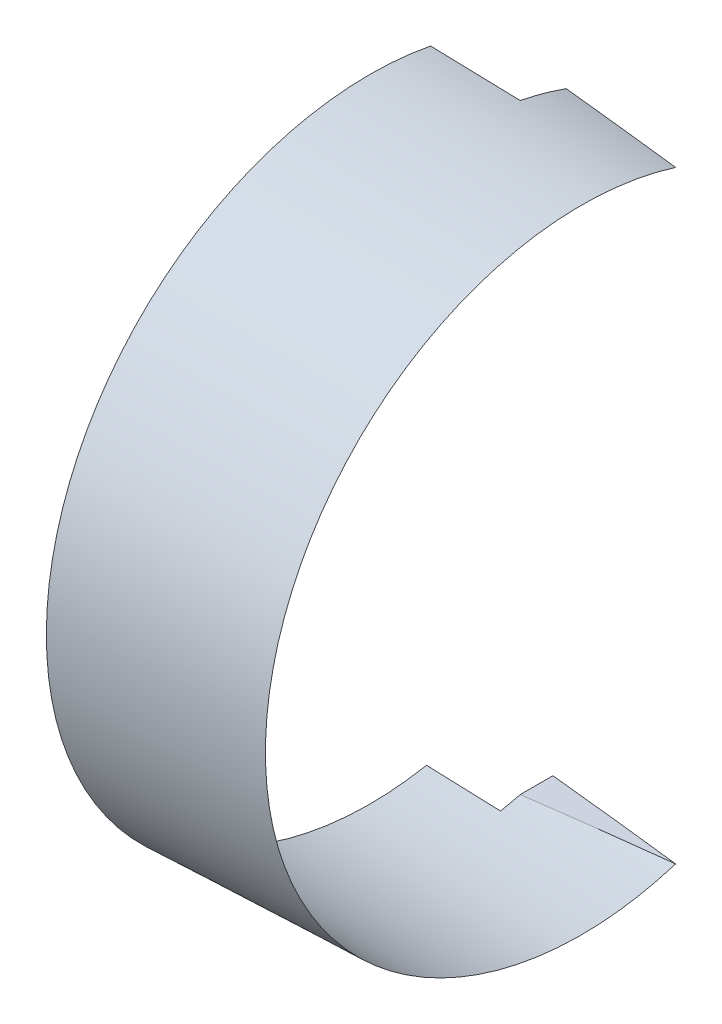
ISO-10303-21;
HEADER;
FILE_DESCRIPTION(('STEP AP214'),'2;1');
FILE_NAME('part.step','',(''),(''),'','','');
FILE_SCHEMA(('AUTOMOTIVE_DESIGN { 1 0 10303 214 1 1 1 1 }'));
ENDSEC;
DATA;
#1=APPLICATION_CONTEXT('core data for automotive mechanical design processes');
#2=APPLICATION_PROTOCOL_DEFINITION('international standard','automotive_design',2000,#1);
#3=PRODUCT_CONTEXT('',#1,'mechanical');
#4=PRODUCT('Part','Part','',(#3));
#5=PRODUCT_RELATED_PRODUCT_CATEGORY('part','',(#4));
#6=PRODUCT_DEFINITION_FORMATION('','',#4);
#7=PRODUCT_DEFINITION_CONTEXT('part definition',#1,'design');
#8=PRODUCT_DEFINITION('design','',#6,#7);
#9=PRODUCT_DEFINITION_SHAPE('','',#8);
#10=(LENGTH_UNIT() NAMED_UNIT(*) SI_UNIT(.MILLI.,.METRE.));
#11=(NAMED_UNIT(*) PLANE_ANGLE_UNIT() SI_UNIT($,.RADIAN.));
#12=(NAMED_UNIT(*) SI_UNIT($,.STERADIAN.) SOLID_ANGLE_UNIT());
#13=UNCERTAINTY_MEASURE_WITH_UNIT(LENGTH_MEASURE(1.E-05),#10,'distance_accuracy_value','');
#14=(GEOMETRIC_REPRESENTATION_CONTEXT(3) GLOBAL_UNCERTAINTY_ASSIGNED_CONTEXT((#13)) GLOBAL_UNIT_ASSIGNED_CONTEXT((#10,
#11,#12)) REPRESENTATION_CONTEXT('',''));
#15=CARTESIAN_POINT('',(0.,0.,0.));
#16=DIRECTION('',(0.,0.,1.));
#17=DIRECTION('',(1.,0.,0.));
#18=AXIS2_PLACEMENT_3D('',#15,#16,#17);
#19=CARTESIAN_POINT('',(-30.4,20.25,10.));
#20=DIRECTION('',(1.,0.,0.));
#21=DIRECTION('',(0.,0.,-1.));
#22=AXIS2_PLACEMENT_3D('',#19,#20,#21);
#23=PLANE('',#22);
#24=CARTESIAN_POINT('',(-30.4,20.25,10.));
#25=DIRECTION('',(-1.,0.,0.));
#26=DIRECTION('',(0.,0.,1.));
#27=AXIS2_PLACEMENT_3D('',#24,#25,#26);
#28=CIRCLE('',#27,21.8730192372937);
#29=CARTESIAN_POINT('',(-30.4,-1.2826345896409,6.15622344769881));
#30=VERTEX_POINT('',#29);
#31=CARTESIAN_POINT('',(-30.4,41.7319096759902,5.88216959703025));
#32=VERTEX_POINT('',#31);
#33=EDGE_CURVE('E96',#30,#32,#28,.T.);
#34=ORIENTED_EDGE('',*,*,#33,.T.);
#35=CARTESIAN_POINT('',(-35.2809816151385,41.9150712459397,5.93306733879514));
#36=CARTESIAN_POINT('',(-35.2156799244927,40.7118391623467,6.55850174005771));
#37=CARTESIAN_POINT('',(-35.1580639980427,40.8508936598999,7.90777717509679));
#38=CARTESIAN_POINT('',(-34.648094678725,41.8913463356917,5.92647455650173));
#39=CARTESIAN_POINT('',(-34.5874994408756,40.7329855433716,6.56544779088039));
#40=CARTESIAN_POINT('',(-34.5237847408817,40.8704410912587,7.88105479625875));
#41=CARTESIAN_POINT('',(-34.0152556339012,41.8676141871513,5.91987976279982));
#42=CARTESIAN_POINT('',(-33.9542630668032,40.7540623106605,6.57036802597755));
#43=CARTESIAN_POINT('',(-33.8895799767418,40.889774683845,7.85264647986157));
#44=CARTESIAN_POINT('',(-32.7496968605726,41.8201363090826,5.90668640145142));
#45=CARTESIAN_POINT('',(-32.6880980602763,40.7956813932788,6.57585912086637));
#46=CARTESIAN_POINT('',(-32.6213511889739,40.9279236774656,7.79207297152685));
#47=CARTESIAN_POINT('',(-32.1169771355272,41.796390579223,5.90008783371286));
#48=CARTESIAN_POINT('',(-32.054902449713,40.816240142011,6.57649464036427));
#49=CARTESIAN_POINT('',(-31.9873271703748,40.9467390652549,7.75990768367434));
#50=CARTESIAN_POINT('',(-30.8518787855769,41.7488938753698,5.88688924097273));
#51=CARTESIAN_POINT('',(-30.789057211283,40.8567869015652,6.57335473674702));
#52=CARTESIAN_POINT('',(-30.7196902837336,40.9837552727974,7.69144553667662));
#53=CARTESIAN_POINT('',(-30.2195001147337,41.7251429043849,5.88028921680727));
#54=CARTESIAN_POINT('',(-30.1561642428217,40.8767905553054,6.56964130279505));
#55=CARTESIAN_POINT('',(-30.0860773514703,41.0019562524431,7.65514976335802));
#56=CARTESIAN_POINT('',(-28.9549857663184,41.6776320631757,5.86708669551654));
#57=CARTESIAN_POINT('',(-28.8908221725302,40.916172538875,6.55759962598259));
#58=CARTESIAN_POINT('',(-28.8191766328192,41.0376157963712,7.57783900375576));
#59=CARTESIAN_POINT('',(-28.3228500863939,41.653872193042,5.8604841984165));
#60=CARTESIAN_POINT('',(-28.2581458651447,40.9355660739896,6.54933065979905));
#61=CARTESIAN_POINT('',(-28.1858888432627,41.0550743680302,7.53682406437634));
#62=CARTESIAN_POINT('',(-27.027456460115,41.6051642136159,5.84694901109855));
#63=CARTESIAN_POINT('',(-26.9622681245744,40.9745729298379,6.52730380386234));
#64=CARTESIAN_POINT('',(-26.8882348003371,41.0899143975297,7.44709841844053));
#65=CARTESIAN_POINT('',(-26.3642149329316,41.5802158031246,5.84001623718216));
#66=CARTESIAN_POINT('',(-26.2984390882934,40.9941795164881,6.51335305440222));
#67=CARTESIAN_POINT('',(-26.2238899977432,41.1072487978185,7.39810634191769));
#68=CARTESIAN_POINT('',(-25.3697108633052,41.5427917991561,5.82961669053969));
#69=CARTESIAN_POINT('',(-25.3000426854913,41.0229619503299,6.48770379780736));
#70=CARTESIAN_POINT('',(-25.2278354639417,41.1322474767367,7.31896973556447));
#71=CARTESIAN_POINT('',(-25.0382468619352,41.530316058139,5.82614987681458));
#72=CARTESIAN_POINT('',(-24.9683449877134,41.0324092623754,6.47842125997903));
#73=CARTESIAN_POINT('',(-24.8958720191684,41.1404137331788,7.29164741779113));
#74=CARTESIAN_POINT('',(-24.3754838699584,41.5053658357537,5.81921659940115));
#75=CARTESIAN_POINT('',(-24.3051502790381,41.0510324114464,6.45817384005793));
#76=CARTESIAN_POINT('',(-24.2321507052404,41.1563501423939,7.2348439806275));
#77=CARTESIAN_POINT('',(-24.044184881645,41.492891354405,5.8157501357182));
#78=CARTESIAN_POINT('',(-23.9736247362144,41.0602107117219,6.44721864331171));
#79=CARTESIAN_POINT('',(-23.9003928389278,41.1641202898061,7.20536283203321));
#80=CARTESIAN_POINT('',(-23.7129882135804,41.4804182523433,5.81228405531762));
#81=CARTESIAN_POINT('',(-23.6411995250586,41.0692647278544,6.43531556709923));
#82=CARTESIAN_POINT('',(-23.5687604403854,41.1716616052915,7.17466430722612));
#83=(BOUNDED_SURFACE() B_SPLINE_SURFACE(3,2,((#35,#36,#37),(#38,#39,#40),(#41,#42,#43),(#44,#45,
#46),(#47,#48,#49),(#50,#51,#52),(#53,#54,#55),(#56,#57,#58),(#59,#60,#61),(#62,#63,#64),(#65,
#66,#67),(#68,#69,#70),(#71,#72,#73),(#74,#75,#76),(#77,#78,#79),(#80,#81,#82)),.UNSPECIFIED.,
.F.,.F.,.F.) B_SPLINE_SURFACE_WITH_KNOTS((4,2,2,2,2,2,2,4),(3,3),(0.,1.9057191896492,
3.81148704268123,5.71675505762359,7.62200413756297,9.62204994760066,10.6222078022821,
11.6223791892886),(0.,1.),
.UNSPECIFIED.) GEOMETRIC_REPRESENTATION_ITEM() RATIONAL_B_SPLINE_SURFACE(((1.,0.82737924409257,
1.),(1.,0.833845700680789,1.),(1.,0.840217705651093,1.),(1.,0.852784134301826,1.),(1.,
0.858978553443484,1.),(1.,0.871199200470827,1.),(1.,0.877225472043016,1.),(1.,0.889121305567349,
1.),(1.,0.894990869076314,1.),(1.,0.906870028061405,1.),(1.,0.912872060123723,1.),(1.,
0.921759461507691,1.),(1.,0.92470284884212,1.),(1.,0.930551350066559,1.),(1.,0.933456463438184,
1.),(1.,0.936342609587408,1.))) REPRESENTATION_ITEM('') SURFACE());
#84=CARTESIAN_POINT('',(-30.4,41.7319096759902,5.88216959703025));
#85=CARTESIAN_POINT('',(-30.4,41.6878195693817,5.9175522892455));
#86=CARTESIAN_POINT('',(-30.4,41.6452448537327,5.95478004241942));
#87=CARTESIAN_POINT('',(-30.4,41.5633834580594,6.03268698333553));
#88=CARTESIAN_POINT('',(-30.4,41.5240966414849,6.07336602760012));
#89=CARTESIAN_POINT('',(-30.4,41.4117278044773,6.20002471887165));
#90=CARTESIAN_POINT('',(-30.4,41.3439243577924,6.29079726591716));
#91=CARTESIAN_POINT('',(-30.4,41.2245026473519,6.48246244024128));
#92=CARTESIAN_POINT('',(-30.4,41.172896635091,6.58336265216687));
#93=CARTESIAN_POINT('',(-30.4,41.0873290702243,6.79238334434123));
#94=CARTESIAN_POINT('',(-30.4,41.0533667222556,6.90050349887249));
#95=CARTESIAN_POINT('',(-30.4,41.0045292212125,7.11897427376612));
#96=CARTESIAN_POINT('',(-30.4,40.9893216092696,7.22924975142653));
#97=CARTESIAN_POINT('',(-30.4,40.980286167903,7.39538291059206));
#98=CARTESIAN_POINT('',(-30.4,40.9795773061846,7.45094325872427));
#99=CARTESIAN_POINT('',(-30.4,40.9827642479135,7.56193507232418));
#100=CARTESIAN_POINT('',(-30.4,40.9866603266212,7.61736652988897));
#101=CARTESIAN_POINT('',(-30.4,40.9928537876657,7.67256604305121));
#102=B_SPLINE_CURVE_WITH_KNOTS('',3,(#84,#85,#86,#87,#88,#89,#90,#91,#92,#93,#94,#95,#96,#97,
#98,#99,#100,#101),.UNSPECIFIED.,.F.,.F.,(4,2,2,2,2,2,2,2,4),(0.,0.169491951608703,
0.338976860521446,0.677136938528495,1.0155521827223,1.35395217009238,1.68626298146877,
1.85279186417215,2.01933070165064),.UNSPECIFIED.);
#103=CARTESIAN_POINT('',(-30.4,40.9928537876657,7.67256604305121));
#104=VERTEX_POINT('',#103);
#105=EDGE_CURVE('E46',#32,#104,#102,.T.);
#106=ORIENTED_EDGE('',*,*,#105,.T.);
#107=CARTESIAN_POINT('',(-30.4,20.25,10.));
#108=DIRECTION('',(1.,0.,0.));
#109=DIRECTION('',(0.,0.,-1.));
#110=AXIS2_PLACEMENT_3D('',#107,#108,#109);
#111=CIRCLE('',#110,20.8730192372937);
#112=CARTESIAN_POINT('',(-30.4,-0.266050153389992,6.15622344769898));
#113=VERTEX_POINT('',#112);
#114=EDGE_CURVE('E98',#113,#104,#111,.F.);
#115=ORIENTED_EDGE('',*,*,#114,.F.);
#116=DIRECTION('',(0.,1.,1.66037818414903E-13));
#117=VECTOR('',#116,1.);
#118=CARTESIAN_POINT('',(-30.4,-2.55,6.1562234476986));
#119=LINE('',#118,#117);
#120=EDGE_CURVE('E86',#30,#113,#119,.T.);
#121=ORIENTED_EDGE('',*,*,#120,.F.);
#122=EDGE_LOOP('',(#34,#106,#115,#121));
#123=FACE_BOUND('',#122,.T.);
#124=ADVANCED_FACE('F17',(#123),#23,.F.);
#125=CARTESIAN_POINT('',(-25.,-0.15,757.817890449207));
#126=DIRECTION('',(0.,-1.,0.));
#127=DIRECTION('',(0.,0.,-1.));
#128=AXIS2_PLACEMENT_3D('',#125,#126,#127);
#129=PLANE('',#128);
#130=DIRECTION('',(0.,0.,-1.));
#131=VECTOR('',#130,1.);
#132=CARTESIAN_POINT('',(-25.4,-0.15,757.817890449207));
#133=LINE('',#132,#131);
#134=CARTESIAN_POINT('',(-25.4,-0.15,4.81903121821762));
#135=VERTEX_POINT('',#134);
#136=CARTESIAN_POINT('',(-25.4,-0.15,2.60667663159342));
#137=VERTEX_POINT('',#136);
#138=EDGE_CURVE('E133',#135,#137,#133,.T.);
#139=ORIENTED_EDGE('',*,*,#138,.F.);
#140=CARTESIAN_POINT('',(10.1181525308279,-0.15,1.02266959439106));
#141=CARTESIAN_POINT('',(9.3477843915307,-0.15,1.08946034541123));
#142=CARTESIAN_POINT('',(8.57746954508266,-0.15,1.15686744882727));
#143=CARTESIAN_POINT('',(7.03655691914137,-0.15,1.29304433133251));
#144=CARTESIAN_POINT('',(6.26595920063215,-0.15,1.3618148003272));
#145=CARTESIAN_POINT('',(4.72112752575068,-0.15,1.50111862239621));
#146=CARTESIAN_POINT('',(3.94689419726085,-0.15,1.5716589466227));
#147=CARTESIAN_POINT('',(2.39896913756692,-0.15,1.71425317198988));
#148=CARTESIAN_POINT('',(1.62527733275722,-0.15,1.7863062751094));
#149=CARTESIAN_POINT('',(-0.919259386082186,-0.15,2.02604357221741));
#150=CARTESIAN_POINT('',(-2.68977328594317,-0.15,2.19726438579486));
#151=CARTESIAN_POINT('',(-6.22999124363823,-0.15,2.55031336395156));
#152=CARTESIAN_POINT('',(-7.9996951581223,-0.15,2.7321429717567));
#153=CARTESIAN_POINT('',(-11.5439661235381,-0.15,3.10965629530984));
#154=CARTESIAN_POINT('',(-13.318528212493,-0.15,3.3053867764074));
#155=CARTESIAN_POINT('',(-16.8646995117103,-0.15,3.71380712456868));
#156=CARTESIAN_POINT('',(-18.636309828484,-0.15,3.92648726256105));
#157=CARTESIAN_POINT('',(-21.2851643048273,-0.15,4.26212343026085));
#158=CARTESIAN_POINT('',(-22.1635175916069,-0.15,4.3763274337102));
#159=CARTESIAN_POINT('',(-23.9193628685318,-0.15,4.61162458040379));
#160=CARTESIAN_POINT('',(-24.796854799483,-0.15,4.73271816742542));
#161=CARTESIAN_POINT('',(-26.5525180507057,-0.15,4.98355858672857));
#162=CARTESIAN_POINT('',(-27.4306868198948,-0.15,5.11332334641819));
#163=CARTESIAN_POINT('',(-29.1852141375451,-0.15,5.3833999628464));
#164=CARTESIAN_POINT('',(-30.0615730461411,-0.15,5.52370946018671));
#165=CARTESIAN_POINT('',(-31.8046538382225,-0.15,5.81693623526656));
#166=CARTESIAN_POINT('',(-32.6713950205206,-0.15,5.96973825113071));
#167=CARTESIAN_POINT('',(-34.4021883194014,-0.15,6.29408587740245));
#168=CARTESIAN_POINT('',(-35.2662376261863,-0.15,6.46564685352767));
#169=CARTESIAN_POINT('',(-36.5561028083291,-0.15,6.74378491100872));
#170=CARTESIAN_POINT('',(-36.9841998012547,-0.15,6.83975780562587));
#171=CARTESIAN_POINT('',(-37.838381726924,-0.15,7.040832959516));
#172=CARTESIAN_POINT('',(-38.2644661493878,-0.15,7.14593741547561));
#173=CARTESIAN_POINT('',(-39.1128058011187,-0.15,7.36826058022749));
#174=CARTESIAN_POINT('',(-39.53506572761,-0.15,7.48546130677333));
#175=CARTESIAN_POINT('',(-40.3743013617469,-0.15,7.7373407407708));
#176=CARTESIAN_POINT('',(-40.7912799058829,-0.15,7.87200958811253));
#177=CARTESIAN_POINT('',(-41.2868839092546,-0.15,8.05130859073838));
#178=CARTESIAN_POINT('',(-41.3704701002029,-0.15,8.08221853787248));
#179=CARTESIAN_POINT('',(-41.5371244693646,-0.15,8.14542621503415));
#180=CARTESIAN_POINT('',(-41.6201925932987,-0.15,8.17772408777155));
#181=CARTESIAN_POINT('',(-41.8686229908221,-0.15,8.27700975395256));
#182=CARTESIAN_POINT('',(-42.0330691409134,-0.15,8.34633888419944));
#183=CARTESIAN_POINT('',(-42.3573379458007,-0.15,8.49296540906684));
#184=CARTESIAN_POINT('',(-42.5171805224504,-0.15,8.57021851368774));
#185=CARTESIAN_POINT('',(-42.8306602160068,-0.15,8.73632645703977));
#186=CARTESIAN_POINT('',(-42.9843070441687,-0.15,8.82516213580718));
#187=CARTESIAN_POINT('',(-43.2196336345814,-0.15,8.98110801214535));
#188=CARTESIAN_POINT('',(-43.3051630078071,-0.15,9.04235490475215));
#189=CARTESIAN_POINT('',(-43.4693973045476,-0.15,9.1735917778491));
#190=CARTESIAN_POINT('',(-43.5481099334993,-0.15,9.24357166241876));
#191=CARTESIAN_POINT('',(-43.6632389521217,-0.15,9.36421557698417));
#192=CARTESIAN_POINT('',(-43.703718761308,-0.15,9.41095629577379));
#193=CARTESIAN_POINT('',(-43.7782641498707,-0.15,9.50936552688335));
#194=CARTESIAN_POINT('',(-43.8123384541944,-0.15,9.56102718962681));
#195=CARTESIAN_POINT('',(-43.8635730121916,-0.15,9.65593938355106));
#196=CARTESIAN_POINT('',(-43.8828318853954,-0.15,9.6980385578331));
#197=CARTESIAN_POINT('',(-43.9143076657566,-0.15,9.78479425674032));
#198=CARTESIAN_POINT('',(-43.9265360851591,-0.15,9.82944646820256));
#199=CARTESIAN_POINT('',(-43.9425592849577,-0.15,9.92073128591658));
#200=CARTESIAN_POINT('',(-43.9462730677812,-0.15,9.96737864655451));
#201=CARTESIAN_POINT('',(-43.9444515545423,-0.15,10.0604999260674));
#202=CARTESIAN_POINT('',(-43.9389141855011,-0.15,10.1069738037299));
#203=CARTESIAN_POINT('',(-43.9206752025029,-0.15,10.1922420324432));
#204=CARTESIAN_POINT('',(-43.9089754005746,-0.15,10.2312608311546));
#205=CARTESIAN_POINT('',(-43.8802553308418,-0.15,10.3072558523467));
#206=CARTESIAN_POINT('',(-43.8632333678804,-0.15,10.3442314196178));
#207=CARTESIAN_POINT('',(-43.8099084619187,-0.15,10.4442198251818));
#208=CARTESIAN_POINT('',(-43.7689908235016,-0.15,10.5047517450037));
#209=CARTESIAN_POINT('',(-43.6787602524554,-0.15,10.6192079685063));
#210=CARTESIAN_POINT('',(-43.6294157251219,-0.15,10.6731060412534));
#211=CARTESIAN_POINT('',(-43.50668542012,-0.15,10.7939132917045));
#212=CARTESIAN_POINT('',(-43.4310480190041,-0.15,10.8585029452344));
#213=CARTESIAN_POINT('',(-43.2739753973511,-0.15,10.9802980532569));
#214=CARTESIAN_POINT('',(-43.1925279314708,-0.15,11.0374871515212));
#215=CARTESIAN_POINT('',(-42.9420123854847,-0.15,11.2012635334478));
#216=CARTESIAN_POINT('',(-42.7674978657285,-0.15,11.2994337761119));
#217=CARTESIAN_POINT('',(-42.4049712792693,-0.15,11.4854454532404));
#218=CARTESIAN_POINT('',(-42.2166982833049,-0.15,11.5727508779497));
#219=CARTESIAN_POINT('',(-41.8357348245321,-0.15,11.7372477045986));
#220=CARTESIAN_POINT('',(-41.6430427230959,-0.15,11.8144352811384));
#221=CARTESIAN_POINT('',(-41.0599386336694,-0.15,12.0354884580573));
#222=CARTESIAN_POINT('',(-40.6654288230063,-0.15,12.1684102389866));
#223=CARTESIAN_POINT('',(-39.8706425455228,-0.15,12.4167924201906));
#224=CARTESIAN_POINT('',(-39.4703597763413,-0.15,12.5322318579582));
#225=CARTESIAN_POINT('',(-38.6670873958007,-0.15,12.7506735932053));
#226=CARTESIAN_POINT('',(-38.2641028233713,-0.15,12.853694527553));
#227=CARTESIAN_POINT('',(-37.4601783376117,-0.15,13.0496941929844));
#228=CARTESIAN_POINT('',(-37.0592609608059,-0.15,13.1427664865019));
#229=CARTESIAN_POINT('',(-36.255882610136,-0.15,13.3220214919038));
#230=CARTESIAN_POINT('',(-35.8534215814389,-0.15,13.40820395663));
#231=CARTESIAN_POINT('',(-34.6442022024362,-0.15,13.658541588315));
#232=CARTESIAN_POINT('',(-33.8357410429889,-0.15,13.8144555432838));
#233=CARTESIAN_POINT('',(-32.2151148259626,-0.15,14.1111936469418));
#234=CARTESIAN_POINT('',(-31.4029465132991,-0.15,14.2519996846613));
#235=CARTESIAN_POINT('',(-29.7767859639218,-0.15,14.5220959044477));
#236=CARTESIAN_POINT('',(-28.9627939085515,-0.15,14.6513871835527));
#237=CARTESIAN_POINT('',(-27.334976817698,-0.15,14.9007424626543));
#238=CARTESIAN_POINT('',(-26.521154358979,-0.15,15.0208233945619));
#239=CARTESIAN_POINT('',(-24.8924555240897,-0.15,15.2537178699878));
#240=CARTESIAN_POINT('',(-24.0775791237586,-0.15,15.3665312437786));
#241=CARTESIAN_POINT('',(-21.6326018952728,-0.15,15.6958761386299));
#242=CARTESIAN_POINT('',(-20.0012935943197,-0.15,15.9034410745902));
#243=CARTESIAN_POINT('',(-16.7702116057473,-0.15,16.2971119063462));
#244=CARTESIAN_POINT('',(-15.1704804492335,-0.15,16.483571733466));
#245=CARTESIAN_POINT('',(-11.9693522104545,-0.15,16.8435893992575));
#246=CARTESIAN_POINT('',(-10.3679549315464,-0.15,17.017145483327));
#247=CARTESIAN_POINT('',(-7.16396915585724,-0.15,17.3539171655096));
#248=CARTESIAN_POINT('',(-5.56138058562879,-0.15,17.5171320612697));
#249=CARTESIAN_POINT('',(-2.35541881956578,-0.15,17.8350264494595));
#250=CARTESIAN_POINT('',(-0.752045654624622,-0.15,17.9897062543438));
#251=CARTESIAN_POINT('',(2.39560166565168,-0.15,18.2862752698416));
#252=CARTESIAN_POINT('',(3.93985123584826,-0.15,18.4284263282041));
#253=CARTESIAN_POINT('',(7.02871573417082,-0.15,18.706970144653));
#254=CARTESIAN_POINT('',(8.57333061085537,-0.15,18.8433634725768));
#255=CARTESIAN_POINT('',(10.1181525308279,-0.15,18.9773304056089));
#256=B_SPLINE_CURVE_WITH_KNOTS('',3,(#140,#141,#142,#143,#144,#145,#146,#147,#148,#149,#150,
#151,#152,#153,#154,#155,#156,#157,#158,#159,#160,#161,#162,#163,#164,#165,#166,#167,#168,#169,
#170,#171,#172,#173,#174,#175,#176,#177,#178,#179,#180,#181,#182,#183,#184,#185,#186,#187,#188,
#189,#190,#191,#192,#193,#194,#195,#196,#197,#198,#199,#200,#201,#202,#203,#204,#205,#206,#207,
#208,#209,#210,#211,#212,#213,#214,#215,#216,#217,#218,#219,#220,#221,#222,#223,#224,#225,#226,
#227,#228,#229,#230,#231,#232,#233,#234,#235,#236,#237,#238,#239,#240,#241,#242,#243,#244,#245,
#246,#247,#248,#249,#250,#251,#252,#253,#254,#255),.UNSPECIFIED.,.F.,.F.,(4,2,2,2,2,2,2,2,2,2,2,
2,2,2,2,2,2,2,2,2,2,2,2,2,2,2,2,2,2,2,2,2,2,2,2,2,2,2,2,2,2,2,2,2,2,2,2,2,2,2,2,2,2,2,2,2,2,4),
(0.,2.3197742201638,4.64075389918069,6.97307273110425,9.30419068351168,14.6404846714749,
19.9775063120299,25.3334211889886,30.6862836219685,33.3435026757533,36.0008930826756,
38.6639585536406,41.3264299243164,43.9666333032225,46.6090157427183,47.9251180731351,
49.2415378861694,50.5560281598814,51.8697796551635,52.1371232307849,52.4044943613965,
52.9396891753206,53.4720406473413,54.0035224156818,54.3187958419285,54.6337081101514,
54.8188537157351,55.0037452773878,55.1421467115915,55.2803208656156,55.4198040767011,
55.5593185470857,55.6810717029792,55.8028636779378,56.0207731059358,56.2395182310439,
56.5371668235688,56.8354624152533,57.4349039162687,58.057183372955,58.6796974292729,
59.927794844905,61.1773771618332,62.4250602039743,63.6597252682995,64.8944346038065,
67.3642645288256,69.8370228975413,72.3095454282002,74.777407850545,77.2453278867849,
82.1785611918834,87.0101861898919,91.8424669770463,96.6750756122055,101.507507216661,
106.159831289212,110.811693840737),.UNSPECIFIED.);
#257=CARTESIAN_POINT('',(-16.0818800189067,-0.150000443993001,3.62458368396145));
#258=VERTEX_POINT('',#257);
#259=EDGE_CURVE('E129',#258,#135,#256,.T.);
#260=ORIENTED_EDGE('',*,*,#259,.F.);
#261=CARTESIAN_POINT('',(-62.8082811067893,-0.15,-0.632879414674593));
#262=CARTESIAN_POINT('',(-61.3386385128492,-0.15,-0.521838131036939));
#263=CARTESIAN_POINT('',(-59.869097676116,-0.15,-0.409449074674871));
#264=CARTESIAN_POINT('',(-56.9302474357948,-0.15,-0.181672687019172));
#265=CARTESIAN_POINT('',(-55.4609380323724,-0.15,-0.0662853535905476));
#266=CARTESIAN_POINT('',(-51.053815742654,-0.15,0.28479495698715));
#267=CARTESIAN_POINT('',(-48.1163948766174,-0.15,0.525437345784086));
#268=CARTESIAN_POINT('',(-42.2456558523834,-0.15,1.02294366032296));
#269=CARTESIAN_POINT('',(-39.3123364138391,-0.15,1.27979235866851));
#270=CARTESIAN_POINT('',(-34.9136102399036,-0.15,1.68109526654592));
#271=CARTESIAN_POINT('',(-33.4474727149579,-0.15,1.81754482732312));
#272=CARTESIAN_POINT('',(-30.5157755952489,-0.15,2.09666245593365));
#273=CARTESIAN_POINT('',(-29.0502160054168,-0.15,2.23933057571735));
#274=CARTESIAN_POINT('',(-26.1176709337122,-0.15,2.53218223708272));
#275=CARTESIAN_POINT('',(-24.650686521203,-0.15,2.68237651434199));
#276=CARTESIAN_POINT('',(-21.717678932816,-0.15,2.99152759042312));
#277=CARTESIAN_POINT('',(-20.2516557311843,-0.15,3.1504841438821));
#278=CARTESIAN_POINT('',(-17.3213387654425,-0.15,3.47908128540218));
#279=CARTESIAN_POINT('',(-15.857044568226,-0.15,3.64871799849616));
#280=CARTESIAN_POINT('',(-12.9299237830079,-0.15,4.00152449878692));
#281=CARTESIAN_POINT('',(-11.4670973542034,-0.15,4.18469562065558));
#282=CARTESIAN_POINT('',(-9.27370509401197,-0.15,4.47295021685592));
#283=CARTESIAN_POINT('',(-8.54226032736781,-0.15,4.57135022665881));
#284=CARTESIAN_POINT('',(-7.08010714679226,-0.15,4.77341516065072));
#285=CARTESIAN_POINT('',(-6.34939872168464,-0.15,4.87708000366384));
#286=CARTESIAN_POINT('',(-4.88910004395577,-0.15,5.09064694973925));
#287=CARTESIAN_POINT('',(-4.15950953541671,-0.15,5.20054729720189));
#288=CARTESIAN_POINT('',(-2.70147090297684,-0.15,5.4279843500634));
#289=CARTESIAN_POINT('',(-1.97302284574466,-0.15,5.54552148528867));
#290=CARTESIAN_POINT('',(-0.516769503285857,-0.15,5.79032752535793));
#291=CARTESIAN_POINT('',(0.211033668997976,-0.15,5.91760905383828));
#292=CARTESIAN_POINT('',(1.6642732890557,-0.15,6.18461411370423));
#293=CARTESIAN_POINT('',(2.38971008100045,-0.15,6.32433574372716));
#294=CARTESIAN_POINT('',(3.47557792907775,-0.15,6.54691410495816));
#295=CARTESIAN_POINT('',(3.83733119287847,-0.15,6.62331392739042));
#296=CARTESIAN_POINT('',(4.55966621000201,-0.15,6.78138533567012));
#297=CARTESIAN_POINT('',(4.92024802927611,-0.15,6.86305661914104));
#298=CARTESIAN_POINT('',(5.64008586490626,-0.15,7.03291398892296));
#299=CARTESIAN_POINT('',(5.99934111267145,-0.15,7.12110337139043));
#300=CARTESIAN_POINT('',(6.71570461701825,-0.15,7.30605389981168));
#301=CARTESIAN_POINT('',(7.07281243790745,-0.15,7.40281672647669));
#302=CARTESIAN_POINT('',(7.42845753958506,-0.15,7.50489636178006));
#303=B_SPLINE_CURVE_WITH_KNOTS('',3,(#261,#262,#263,#264,#265,#266,#267,#268,#269,#270,#271,
#272,#273,#274,#275,#276,#277,#278,#279,#280,#281,#282,#283,#284,#285,#286,#287,#288,#289,#290,
#291,#292,#293,#294,#295,#296,#297,#298,#299,#300,#301,#302),.UNSPECIFIED.,.F.,.F.,(4,2,2,2,2,2,
2,2,2,2,2,2,2,2,2,2,2,2,2,2,4),(0.,4.42149392257532,8.84299099366609,17.6847399449881,
26.5183014855311,30.9357110578034,35.3531575405593,39.7770953657568,44.2009093738987,
48.6231274850162,53.045782268892,55.2598690348606,57.4739216732695,59.6873540113512,
61.9009110376157,64.1173858469945,66.3335224668844,67.4426896258096,68.5517932181928,
69.661461565257,70.7713479315919),.UNSPECIFIED.);
#304=EDGE_CURVE('E117',#137,#258,#303,.T.);
#305=ORIENTED_EDGE('',*,*,#304,.F.);
#306=EDGE_LOOP('',(#139,#260,#305));
#307=FACE_BOUND('',#306,.T.);
#308=ADVANCED_FACE('F168',(#307),#129,.F.);
#309=CARTESIAN_POINT('',(-30.4,20.25,10.));
#310=DIRECTION('',(-1.,0.,0.));
#311=DIRECTION('',(0.,0.,1.));
#312=AXIS2_PLACEMENT_3D('',#309,#310,#311);
#313=CONICAL_SURFACE('',#312,21.8730192372937,0.0349065850398866);
#314=ORIENTED_EDGE('',*,*,#33,.F.);
#315=CARTESIAN_POINT('',(-45.8202713528625,-1.82942541989308,6.15622344769872));
#316=CARTESIAN_POINT('',(-40.2575349457529,-1.6322532493347,6.15622344769875));
#317=CARTESIAN_POINT('',(-34.6948015274562,-1.43499682873017,6.15622344769878));
#318=CARTESIAN_POINT('',(-23.5693406684183,-1.04031548742631,6.15622344769884));
#319=CARTESIAN_POINT('',(-18.0066132276771,-0.842890566726982,6.15622344769888));
#320=CARTESIAN_POINT('',(-12.4438887757489,-0.645381395981497,6.15622344769891));
#321=B_SPLINE_CURVE_WITH_KNOTS('',3,(#315,#316,#317,#318,#319,#320),.UNSPECIFIED.,.F.,.F.,(4,2,
4),(0.,16.6986891283879,33.397378256987),.UNSPECIFIED.);
#322=CARTESIAN_POINT('',(-25.4,-1.10524788537483,6.15622344769884));
#323=VERTEX_POINT('',#322);
#324=EDGE_CURVE('E83',#30,#323,#321,.T.);
#325=ORIENTED_EDGE('',*,*,#324,.T.);
#326=CARTESIAN_POINT('',(-25.4,20.25,10.));
#327=DIRECTION('',(-1.,0.,0.));
#328=DIRECTION('',(0.,0.,1.));
#329=AXIS2_PLACEMENT_3D('',#326,#327,#328);
#330=CIRCLE('',#329,21.6984153898349);
#331=EDGE_CURVE('E94',#137,#323,#330,.T.);
#332=ORIENTED_EDGE('',*,*,#331,.F.);
#333=ORIENTED_EDGE('',*,*,#304,.T.);
#334=CARTESIAN_POINT('',(-16.0818733585423,20.25,10.));
#335=DIRECTION('',(-1.,0.,0.));
#336=DIRECTION('',(0.,0.,1.));
#337=AXIS2_PLACEMENT_3D('',#334,#335,#336);
#338=CIRCLE('',#337,21.3730192372937);
#339=CARTESIAN_POINT('',(-16.0818800189067,40.6500006659895,3.62458439430303));
#340=VERTEX_POINT('',#339);
#341=EDGE_CURVE('E113',#258,#340,#338,.T.);
#342=ORIENTED_EDGE('',*,*,#341,.T.);
#343=CARTESIAN_POINT('',(7.42845753958506,40.65,7.50489636178011));
#344=CARTESIAN_POINT('',(7.07281243790746,40.65,7.40281672647672));
#345=CARTESIAN_POINT('',(6.71570461701827,40.65,7.30605389981169));
#346=CARTESIAN_POINT('',(5.99934111267147,40.65,7.12110337139041));
#347=CARTESIAN_POINT('',(5.64008586490628,40.65,7.03291398892294));
#348=CARTESIAN_POINT('',(4.92024802927614,40.65,6.86305661914102));
#349=CARTESIAN_POINT('',(4.55966621000202,40.65,6.78138533567012));
#350=CARTESIAN_POINT('',(3.83733119287848,40.65,6.62331392739041));
#351=CARTESIAN_POINT('',(3.47557792907777,40.65,6.54691410495813));
#352=CARTESIAN_POINT('',(2.38971008100048,40.65,6.32433574372711));
#353=CARTESIAN_POINT('',(1.66427328905572,40.65,6.18461411370421));
#354=CARTESIAN_POINT('',(0.21103366899799,40.65,5.91760905383828));
#355=CARTESIAN_POINT('',(-0.516769503285843,40.65,5.79032752535791));
#356=CARTESIAN_POINT('',(-1.97302284574464,40.65,5.54552148528865));
#357=CARTESIAN_POINT('',(-2.70147090297682,40.65,5.42798435006339));
#358=CARTESIAN_POINT('',(-4.15950953541669,40.65,5.20054729720187));
#359=CARTESIAN_POINT('',(-4.88910004395574,40.65,5.09064694973922));
#360=CARTESIAN_POINT('',(-6.34939872168461,40.65,4.87708000366382));
#361=CARTESIAN_POINT('',(-7.08010714679223,40.65,4.7734151606507));
#362=CARTESIAN_POINT('',(-8.54226032736777,40.65,4.5713502266588));
#363=CARTESIAN_POINT('',(-9.27370509401193,40.65,4.47295021685591));
#364=CARTESIAN_POINT('',(-11.4670973542033,40.65,4.18469562065557));
#365=CARTESIAN_POINT('',(-12.9299237830079,40.65,4.00152449878691));
#366=CARTESIAN_POINT('',(-15.857044568226,40.65,3.64871799849616));
#367=CARTESIAN_POINT('',(-17.3213387654424,40.65,3.4790812854022));
#368=CARTESIAN_POINT('',(-20.2516557311842,40.65,3.15048414388206));
#369=CARTESIAN_POINT('',(-21.7176789328159,40.65,2.991527590423));
#370=CARTESIAN_POINT('',(-24.6506865212029,40.65,2.68237651434211));
#371=CARTESIAN_POINT('',(-26.1176709337122,40.65,2.53218223708314));
#372=CARTESIAN_POINT('',(-29.0502160054168,40.65,2.23933057571777));
#373=CARTESIAN_POINT('',(-30.5157755952488,40.65,2.09666245593376));
#374=CARTESIAN_POINT('',(-33.4474727149579,40.65,1.81754482732299));
#375=CARTESIAN_POINT('',(-34.9136102399035,40.65,1.68109526654587));
#376=CARTESIAN_POINT('',(-39.312336413839,40.65,1.27979235866859));
#377=CARTESIAN_POINT('',(-42.2456558523833,40.65,1.02294366032298));
#378=CARTESIAN_POINT('',(-48.1163948766173,40.65,0.525437345784067));
#379=CARTESIAN_POINT('',(-51.0538157426539,40.65,0.284794956987152));
#380=CARTESIAN_POINT('',(-55.4609380323723,40.65,-0.0662853535905392));
#381=CARTESIAN_POINT('',(-56.9302474357947,40.65,-0.181672687019166));
#382=CARTESIAN_POINT('',(-59.8690976761159,40.65,-0.409449074674868));
#383=CARTESIAN_POINT('',(-61.3386385128491,40.65,-0.521838131036937));
#384=CARTESIAN_POINT('',(-62.8082811067892,40.65,-0.632879414674586));
#385=B_SPLINE_CURVE_WITH_KNOTS('',3,(#343,#344,#345,#346,#347,#348,#349,#350,#351,#352,#353,
#354,#355,#356,#357,#358,#359,#360,#361,#362,#363,#364,#365,#366,#367,#368,#369,#370,#371,#372,
#373,#374,#375,#376,#377,#378,#379,#380,#381,#382,#383,#384),.UNSPECIFIED.,.F.,.F.,(4,2,2,2,2,2,
2,2,2,2,2,2,2,2,2,2,2,2,2,2,4),(0.,1.10988636633487,2.21955471339913,3.32865830578234,
4.43782546470755,6.65396208459746,8.87043689397619,11.0839939202407,13.2974262583225,
15.5114788967313,17.7255656626999,22.1482204465757,26.5704385576932,30.9942525658352,
35.4181903910326,39.8356368737885,44.2530464460608,53.0866079866038,61.9283569379258,
66.3498540090165,70.7713479315918),.UNSPECIFIED.);
#386=CARTESIAN_POINT('',(-24.4,40.65,2.70980115733191));
#387=VERTEX_POINT('',#386);
#388=EDGE_CURVE('E106',#340,#387,#385,.T.);
#389=ORIENTED_EDGE('',*,*,#388,.T.);
#390=CARTESIAN_POINT('',(-24.4,20.25,10.));
#391=DIRECTION('',(1.,0.,0.));
#392=DIRECTION('',(0.,0.,-1.));
#393=AXIS2_PLACEMENT_3D('',#390,#391,#392);
#394=CIRCLE('',#393,21.6634946203432);
#395=CARTESIAN_POINT('',(-24.4,41.5062982617679,5.81947570603851));
#396=VERTEX_POINT('',#395);
#397=EDGE_CURVE('E234',#387,#396,#394,.T.);
#398=ORIENTED_EDGE('',*,*,#397,.T.);
#399=CARTESIAN_POINT('',(-24.3998,41.5062907323212,5.8194736137228));
#400=CARTESIAN_POINT('',(-25.3998648441575,41.5439401356718,5.82993579533581));
#401=CARTESIAN_POINT('',(-26.3999305995709,41.581567041938,5.8403917253602));
#402=CARTESIAN_POINT('',(-28.4000639329042,41.6567758603019,5.86129108223173));
#403=CARTESIAN_POINT('',(-29.4001315108242,41.6943577723995,5.87173450907886));
#404=CARTESIAN_POINT('',(-30.4002,41.7319171874128,5.88217168433738));
#405=B_SPLINE_CURVE_WITH_KNOTS('',3,(#399,#400,#401,#402,#403,#404),.UNSPECIFIED.,.F.,.F.,(4,2,
4),(0.,3.00248391024591,6.00496782047607),.UNSPECIFIED.);
#406=EDGE_CURVE('E104',#396,#32,#405,.T.);
#407=ORIENTED_EDGE('',*,*,#406,.T.);
#408=EDGE_LOOP('',(#314,#325,#332,#333,#342,#389,#398,#407));
#409=FACE_BOUND('',#408,.T.);
#410=ADVANCED_FACE('F101',(#409),#313,.T.);
#411=CARTESIAN_POINT('',(-30.4,20.25,10.));
#412=DIRECTION('',(1.,0.,0.));
#413=DIRECTION('',(0.,0.,-1.));
#414=AXIS2_PLACEMENT_3D('',#411,#412,#413);
#415=CONICAL_SURFACE('',#414,20.8730192372937,0.0349065850398866);
#416=ORIENTED_EDGE('',*,*,#114,.T.);
#417=CARTESIAN_POINT('',(-35.1580639980427,40.8508936598999,7.90777717509679));
#418=CARTESIAN_POINT('',(-34.5237847408817,40.8704410912587,7.88105479625875));
#419=CARTESIAN_POINT('',(-33.8895799767418,40.889774683845,7.85264647986158));
#420=CARTESIAN_POINT('',(-32.6213511889739,40.9279236774656,7.79207297152685));
#421=CARTESIAN_POINT('',(-31.9873271703748,40.9467390652549,7.75990768367434));
#422=CARTESIAN_POINT('',(-30.7196902837336,40.9837552727974,7.69144553667662));
#423=CARTESIAN_POINT('',(-30.0860773514703,41.0019562524431,7.65514976335802));
#424=CARTESIAN_POINT('',(-28.8191766328192,41.0376157963712,7.57783900375576));
#425=CARTESIAN_POINT('',(-28.1858888432627,41.0550743680302,7.53682406437634));
#426=CARTESIAN_POINT('',(-26.8882348003371,41.0899143975297,7.44709841844053));
#427=CARTESIAN_POINT('',(-26.2238899977432,41.1072487978185,7.39810634191769));
#428=CARTESIAN_POINT('',(-25.2278354639417,41.1322474767367,7.31896973556447));
#429=CARTESIAN_POINT('',(-24.8958720191684,41.1404137331788,7.29164741779113));
#430=CARTESIAN_POINT('',(-24.2321507052404,41.1563501423939,7.2348439806275));
#431=CARTESIAN_POINT('',(-23.9003928389278,41.1641202898061,7.20536283203321));
#432=CARTESIAN_POINT('',(-23.5687604403854,41.1716616052915,7.17466430722612));
#433=B_SPLINE_CURVE_WITH_KNOTS('',3,(#417,#418,#419,#420,#421,#422,#423,#424,#425,#426,#427,
#428,#429,#430,#431,#432),.UNSPECIFIED.,.F.,.F.,(4,2,2,2,2,2,2,4),(0.,1.9057191896492,
3.81148704268123,5.71675505762359,7.62200413756297,9.62204994760066,10.6222078022821,
11.6223791892886),.UNSPECIFIED.);
#434=CARTESIAN_POINT('',(-24.4,41.1523057626368,7.24913301459897));
#435=VERTEX_POINT('',#434);
#436=EDGE_CURVE('E31',#104,#435,#433,.T.);
#437=ORIENTED_EDGE('',*,*,#436,.T.);
#438=CARTESIAN_POINT('',(-24.4,20.25,10.));
#439=DIRECTION('',(1.,0.,0.));
#440=DIRECTION('',(0.,0.,-1.));
#441=AXIS2_PLACEMENT_3D('',#438,#439,#440);
#442=CIRCLE('',#441,21.0825438542442);
#443=CARTESIAN_POINT('',(-24.4,40.65,4.67894226998722));
#444=VERTEX_POINT('',#443);
#445=EDGE_CURVE('E38',#444,#435,#442,.T.);
#446=ORIENTED_EDGE('',*,*,#445,.F.);
#447=CARTESIAN_POINT('',(10.1181525308279,40.65,18.9773304056089));
#448=CARTESIAN_POINT('',(9.34778439153071,40.65,18.9105396545888));
#449=CARTESIAN_POINT('',(8.57746954508267,40.65,18.8431325511727));
#450=CARTESIAN_POINT('',(7.03655691914136,40.65,18.7069556686675));
#451=CARTESIAN_POINT('',(6.26595920063214,40.65,18.6381851996728));
#452=CARTESIAN_POINT('',(4.72112752575067,40.65,18.4988813776038));
#453=CARTESIAN_POINT('',(3.94689419726085,40.65,18.4283410533773));
#454=CARTESIAN_POINT('',(2.39896913756692,40.65,18.2857468280101));
#455=CARTESIAN_POINT('',(1.62527733275723,40.65,18.2136937248906));
#456=CARTESIAN_POINT('',(-0.919259386082167,40.65,17.9739564277826));
#457=CARTESIAN_POINT('',(-2.68977328594314,40.65,17.8027356142052));
#458=CARTESIAN_POINT('',(-6.22999124363818,40.65,17.4496866360485));
#459=CARTESIAN_POINT('',(-7.99969515812223,40.65,17.2678570282433));
#460=CARTESIAN_POINT('',(-11.543966123538,40.65,16.8903437046902));
#461=CARTESIAN_POINT('',(-13.3185282124929,40.65,16.6946132235926));
#462=CARTESIAN_POINT('',(-16.8646995117101,40.65,16.2861928754314));
#463=CARTESIAN_POINT('',(-18.6363098284838,40.65,16.073512737439));
#464=CARTESIAN_POINT('',(-21.285164304827,40.65,15.7378765697392));
#465=CARTESIAN_POINT('',(-22.1635175916066,40.65,15.6236725662898));
#466=CARTESIAN_POINT('',(-23.9193628685315,40.65,15.3883754195963));
#467=CARTESIAN_POINT('',(-24.7968547994828,40.65,15.2672818325746));
#468=CARTESIAN_POINT('',(-26.5525180507054,40.65,15.0164414132715));
#469=CARTESIAN_POINT('',(-27.4306868198945,40.65,14.8866766535819));
#470=CARTESIAN_POINT('',(-29.1852141375448,40.65,14.6166000371537));
#471=CARTESIAN_POINT('',(-30.0615730461408,40.65,14.4762905398134));
#472=CARTESIAN_POINT('',(-31.8046538382222,40.65,14.1830637647335));
#473=CARTESIAN_POINT('',(-32.6713950205203,40.65,14.0302617488694));
#474=CARTESIAN_POINT('',(-34.4021883194012,40.65,13.7059141225976));
#475=CARTESIAN_POINT('',(-35.266237626186,40.65,13.5343531464724));
#476=CARTESIAN_POINT('',(-36.5561028083289,40.65,13.2562150889914));
#477=CARTESIAN_POINT('',(-36.9841998012545,40.65,13.1602421943742));
#478=CARTESIAN_POINT('',(-37.8383817269238,40.65,12.9591670404841));
#479=CARTESIAN_POINT('',(-38.2644661493877,40.65,12.8540625845244));
#480=CARTESIAN_POINT('',(-39.1128058011186,40.65,12.6317394197726));
#481=CARTESIAN_POINT('',(-39.53506572761,40.65,12.5145386932268));
#482=CARTESIAN_POINT('',(-40.3743013617469,40.65,12.2626592592292));
#483=CARTESIAN_POINT('',(-40.7912799058828,40.65,12.1279904118872));
#484=CARTESIAN_POINT('',(-41.2868839092547,40.65,11.9486914092616));
#485=CARTESIAN_POINT('',(-41.3704701002029,40.65,11.9177814621275));
#486=CARTESIAN_POINT('',(-41.5371244693646,40.65,11.8545737849659));
#487=CARTESIAN_POINT('',(-41.6201925932987,40.65,11.8222759122285));
#488=CARTESIAN_POINT('',(-41.8686229908221,40.65,11.7229902460475));
#489=CARTESIAN_POINT('',(-42.0330691409133,40.65,11.6536611158006));
#490=CARTESIAN_POINT('',(-42.3573379458006,40.65,11.5070345909332));
#491=CARTESIAN_POINT('',(-42.5171805224502,40.65,11.4297814863124));
#492=CARTESIAN_POINT('',(-42.8306602160065,40.65,11.2636735429604));
#493=CARTESIAN_POINT('',(-42.9843070441683,40.65,11.1748378641929));
#494=CARTESIAN_POINT('',(-43.2196336345812,40.65,11.0188919878548));
#495=CARTESIAN_POINT('',(-43.305163007807,40.65,10.957645095248));
#496=CARTESIAN_POINT('',(-43.4693973045475,40.65,10.8264082221509));
#497=CARTESIAN_POINT('',(-43.548109933499,40.65,10.7564283375811));
#498=CARTESIAN_POINT('',(-43.6632389521217,40.65,10.6357844230157));
#499=CARTESIAN_POINT('',(-43.7037187613081,40.65,10.5890437042263));
#500=CARTESIAN_POINT('',(-43.7782641498707,40.65,10.4906344731167));
#501=CARTESIAN_POINT('',(-43.8123384541942,40.65,10.4389728103731));
#502=CARTESIAN_POINT('',(-43.8635730121916,40.65,10.3440606164489));
#503=CARTESIAN_POINT('',(-43.8828318853956,40.65,10.301961442167));
#504=CARTESIAN_POINT('',(-43.9143076657568,40.65,10.2152057432597));
#505=CARTESIAN_POINT('',(-43.926536085159,40.65,10.1705535317974));
#506=CARTESIAN_POINT('',(-43.9425592849576,40.65,10.0792687140833));
#507=CARTESIAN_POINT('',(-43.9462730677813,40.65,10.0326213534454));
#508=CARTESIAN_POINT('',(-43.9444515545424,40.65,9.93950007393251));
#509=CARTESIAN_POINT('',(-43.9389141855009,40.65,9.89302619627006));
#510=CARTESIAN_POINT('',(-43.9206752025027,40.65,9.80775796755668));
#511=CARTESIAN_POINT('',(-43.9089754005747,40.65,9.76873916884521));
#512=CARTESIAN_POINT('',(-43.8802553308419,40.65,9.69274414765312));
#513=CARTESIAN_POINT('',(-43.8632333678804,40.65,9.65576858038204));
#514=CARTESIAN_POINT('',(-43.8099084619184,40.65,9.55578017481815));
#515=CARTESIAN_POINT('',(-43.7689908235015,40.65,9.49524825499612));
#516=CARTESIAN_POINT('',(-43.6787602524554,40.65,9.38079203149348));
#517=CARTESIAN_POINT('',(-43.6294157251217,40.65,9.3268939587464));
#518=CARTESIAN_POINT('',(-43.5066854201196,40.65,9.20608670829531));
#519=CARTESIAN_POINT('',(-43.4310480190037,40.65,9.14149705476533));
#520=CARTESIAN_POINT('',(-43.2739753973507,40.65,9.01970194674268));
#521=CARTESIAN_POINT('',(-43.1925279314704,40.65,8.96251284847839));
#522=CARTESIAN_POINT('',(-42.9420123854841,40.65,8.79873646655177));
#523=CARTESIAN_POINT('',(-42.7674978657278,40.65,8.70056622388771));
#524=CARTESIAN_POINT('',(-42.4049712792684,40.65,8.51455454675919));
#525=CARTESIAN_POINT('',(-42.2166982833038,40.65,8.42724912204977));
#526=CARTESIAN_POINT('',(-41.8357348245307,40.65,8.26275229540076));
#527=CARTESIAN_POINT('',(-41.6430427230943,40.65,8.1855647188609));
#528=CARTESIAN_POINT('',(-41.0599386336674,40.65,7.96451154194197));
#529=CARTESIAN_POINT('',(-40.6654288230041,40.65,7.83158976101264));
#530=CARTESIAN_POINT('',(-39.87064254552,40.65,7.58320757980856));
#531=CARTESIAN_POINT('',(-39.4703597763382,40.65,7.46776814204093));
#532=CARTESIAN_POINT('',(-38.667087395797,40.65,7.24932640679375));
#533=CARTESIAN_POINT('',(-38.2641028233673,40.65,7.14630547244598));
#534=CARTESIAN_POINT('',(-37.460178337607,40.65,6.9503058070145));
#535=CARTESIAN_POINT('',(-37.0592609608009,40.65,6.85723351349699));
#536=CARTESIAN_POINT('',(-36.2558826101305,40.65,6.67797850809498));
#537=CARTESIAN_POINT('',(-35.853421581433,40.65,6.59179604336874));
#538=CARTESIAN_POINT('',(-34.6442022024295,40.65,6.34145841168367));
#539=CARTESIAN_POINT('',(-33.8357410429815,40.65,6.1855444567148));
#540=CARTESIAN_POINT('',(-32.2151148259541,40.65,5.88880635305665));
#541=CARTESIAN_POINT('',(-31.40294651329,40.65,5.74800031533709));
#542=CARTESIAN_POINT('',(-29.7767859639114,40.65,5.47790409555056));
#543=CARTESIAN_POINT('',(-28.9627939085406,40.65,5.34861281644559));
#544=CARTESIAN_POINT('',(-27.3349768176859,40.65,5.09925753734393));
#545=CARTESIAN_POINT('',(-26.5211543589664,40.65,4.97917660543619));
#546=CARTESIAN_POINT('',(-24.8924555240759,40.65,4.7462821300102));
#547=CARTESIAN_POINT('',(-24.0775791237442,40.65,4.63346875621944));
#548=CARTESIAN_POINT('',(-21.6326018952567,40.65,4.30412386136804));
#549=CARTESIAN_POINT('',(-20.0012935943025,40.65,4.09655892540767));
#550=CARTESIAN_POINT('',(-16.7702116057304,40.65,3.70288809365181));
#551=CARTESIAN_POINT('',(-15.1704804492181,40.65,3.51642826653226));
#552=CARTESIAN_POINT('',(-11.9693522104423,40.65,3.15641060074112));
#553=CARTESIAN_POINT('',(-10.3679549315357,40.65,2.9828545166719));
#554=CARTESIAN_POINT('',(-7.16396915584958,40.65,2.64608283448957));
#555=CARTESIAN_POINT('',(-5.56138058562266,40.65,2.48286793872971));
#556=CARTESIAN_POINT('',(-2.35541881956271,40.65,2.16497355054015));
#557=CARTESIAN_POINT('',(-0.752045654623083,40.65,2.01029374565602));
#558=CARTESIAN_POINT('',(2.39560166565169,40.65,1.71372473015835));
#559=CARTESIAN_POINT('',(3.93985123584828,40.65,1.57157367179589));
#560=CARTESIAN_POINT('',(7.02871573417083,40.65,1.29302985534703));
#561=CARTESIAN_POINT('',(8.57333061085537,40.65,1.15663652742321));
#562=CARTESIAN_POINT('',(10.1181525308279,40.65,1.02266959439107));
#563=B_SPLINE_CURVE_WITH_KNOTS('',3,(#447,#448,#449,#450,#451,#452,#453,#454,#455,#456,#457,
#458,#459,#460,#461,#462,#463,#464,#465,#466,#467,#468,#469,#470,#471,#472,#473,#474,#475,#476,
#477,#478,#479,#480,#481,#482,#483,#484,#485,#486,#487,#488,#489,#490,#491,#492,#493,#494,#495,
#496,#497,#498,#499,#500,#501,#502,#503,#504,#505,#506,#507,#508,#509,#510,#511,#512,#513,#514,
#515,#516,#517,#518,#519,#520,#521,#522,#523,#524,#525,#526,#527,#528,#529,#530,#531,#532,#533,
#534,#535,#536,#537,#538,#539,#540,#541,#542,#543,#544,#545,#546,#547,#548,#549,#550,#551,#552,
#553,#554,#555,#556,#557,#558,#559,#560,#561,#562),.UNSPECIFIED.,.F.,.F.,(4,2,2,2,2,2,2,2,2,2,2,
2,2,2,2,2,2,2,2,2,2,2,2,2,2,2,2,2,2,2,2,2,2,2,2,2,2,2,2,2,2,2,2,2,2,2,2,2,2,2,2,2,2,2,2,2,2,4),
(0.,2.31977422016381,4.64075389918072,6.97307273110427,9.30419068351169,14.6404846714749,
19.9775063120298,25.3334211889884,30.6862836219682,33.3435026757531,36.0008930826754,
38.6639585536403,41.3264299243161,43.9666333032222,46.6090157427181,47.925118073135,
49.2415378861692,50.5560281598814,51.8697796551636,52.1371232307849,52.4044943613965,
52.9396891753205,53.472040647341,54.0035224156815,54.3187958419284,54.6337081101515,
54.8188537157351,55.0037452773878,55.1421467115915,55.2803208656156,55.4198040767012,
55.5593185470858,55.6810717029794,55.8028636779379,56.020773105936,56.2395182310442,
56.5371668235693,56.835462415254,57.4349039162696,58.0571833729564,58.6796974292747,
59.9277948449077,61.1773771618368,62.4250602039788,63.6597252683049,64.8944346038128,
67.3642645288337,69.8370228975512,72.3095454282118,74.7774078505584,77.2453278868,
82.1785611919019,87.0101861899058,91.8424669770556,96.6750756122101,101.507507216661,
106.159831289212,110.811693840737),.UNSPECIFIED.);
#564=EDGE_CURVE('E189',#444,#340,#563,.T.);
#565=ORIENTED_EDGE('',*,*,#564,.T.);
#566=ORIENTED_EDGE('',*,*,#341,.F.);
#567=ORIENTED_EDGE('',*,*,#259,.T.);
#568=CARTESIAN_POINT('',(-25.4,20.25,10.));
#569=DIRECTION('',(-1.,0.,0.));
#570=DIRECTION('',(0.,0.,1.));
#571=AXIS2_PLACEMENT_3D('',#568,#569,#570);
#572=CIRCLE('',#571,21.0476230847524);
#573=CARTESIAN_POINT('',(-25.4,-0.443666164645262,6.15622344769895));
#574=VERTEX_POINT('',#573);
#575=EDGE_CURVE('E287',#135,#574,#572,.T.);
#576=ORIENTED_EDGE('',*,*,#575,.T.);
#577=CARTESIAN_POINT('',(-44.894341895488,0.249135047872851,6.15622344769906));
#578=CARTESIAN_POINT('',(-39.6464118729362,0.0625245356625217,6.15622344769903));
#579=CARTESIAN_POINT('',(-34.3984788096362,-0.124000384887918,6.156223447699));
#580=CARTESIAN_POINT('',(-23.9026066016162,-0.496879042666322,6.15622344769894));
#581=CARTESIAN_POINT('',(-18.6546674568961,-0.683232779894289,6.15622344769891));
#582=CARTESIAN_POINT('',(-13.4067252714279,-0.869500925462369,6.15622344769888));
#583=B_SPLINE_CURVE_WITH_KNOTS('',3,(#577,#578,#579,#580,#581,#582),.UNSPECIFIED.,.F.,.F.,(4,2,
4),(0.,15.7537404080988,31.5074808159696),.UNSPECIFIED.);
#584=EDGE_CURVE('E135',#113,#574,#583,.T.);
#585=ORIENTED_EDGE('',*,*,#584,.F.);
#586=EDGE_LOOP('',(#416,#437,#446,#565,#566,#567,#576,#585));
#587=FACE_BOUND('',#586,.T.);
#588=ADVANCED_FACE('F149',(#587),#415,.F.);
#589=CARTESIAN_POINT('',(-30.4,40.65,757.817890449207));
#590=DIRECTION('',(0.,1.,0.));
#591=DIRECTION('',(0.,0.,1.));
#592=AXIS2_PLACEMENT_3D('',#589,#590,#591);
#593=PLANE('',#592);
#594=ORIENTED_EDGE('',*,*,#564,.F.);
#595=DIRECTION('',(0.,0.,-1.));
#596=VECTOR('',#595,1.);
#597=CARTESIAN_POINT('',(-24.4,40.65,757.817890449207));
#598=LINE('',#597,#596);
#599=EDGE_CURVE('E211',#444,#387,#598,.T.);
#600=ORIENTED_EDGE('',*,*,#599,.T.);
#601=ORIENTED_EDGE('',*,*,#388,.F.);
#602=EDGE_LOOP('',(#594,#600,#601));
#603=FACE_BOUND('',#602,.T.);
#604=ADVANCED_FACE('F192',(#603),#593,.F.);
#605=CARTESIAN_POINT('',(-24.4,0.,0.));
#606=DIRECTION('',(1.,0.,0.));
#607=DIRECTION('',(0.,0.,-1.));
#608=AXIS2_PLACEMENT_3D('',#605,#606,#607);
#609=PLANE('',#608);
#610=ORIENTED_EDGE('',*,*,#599,.F.);
#611=ORIENTED_EDGE('',*,*,#445,.T.);
#612=CARTESIAN_POINT('',(-24.4,41.1523057626368,7.24913301459897));
#613=CARTESIAN_POINT('',(-24.4,41.1439159914546,7.18546799208529));
#614=CARTESIAN_POINT('',(-24.4,41.1385895146107,7.12140088490385));
#615=CARTESIAN_POINT('',(-24.4,41.1340620113556,6.99305857146992));
#616=CARTESIAN_POINT('',(-24.4,41.1348601905749,6.92878339328519));
#617=CARTESIAN_POINT('',(-24.4,41.1424484618017,6.80276678713204));
#618=CARTESIAN_POINT('',(-24.4,41.1490354577342,6.7410130465537));
#619=CARTESIAN_POINT('',(-24.4,41.167870110091,6.61837830852226));
#620=CARTESIAN_POINT('',(-24.4,41.1801174207337,6.55749725799182));
#621=CARTESIAN_POINT('',(-24.4,41.2100126043628,6.4376906031175));
#622=CARTESIAN_POINT('',(-24.4,41.2276080912784,6.37875192003751));
#623=CARTESIAN_POINT('',(-24.4,41.2681045771842,6.26272378823077));
#624=CARTESIAN_POINT('',(-24.4,41.2910057928618,6.20563441513895));
#625=CARTESIAN_POINT('',(-24.4,41.3428016778299,6.09184604401947));
#626=CARTESIAN_POINT('',(-24.4,41.3718762594496,6.03522885403218));
#627=CARTESIAN_POINT('',(-24.4,41.4352410181202,5.92498211572653));
#628=CARTESIAN_POINT('',(-24.4,41.4695319417686,5.87135299658436));
#629=CARTESIAN_POINT('',(-24.4,41.5062982617679,5.81947570603851));
#630=B_SPLINE_CURVE_WITH_KNOTS('',3,(#612,#613,#614,#615,#616,#617,#618,#619,#620,#621,#622,
#623,#624,#625,#626,#627,#628,#629),.UNSPECIFIED.,.F.,.F.,(4,2,2,2,2,2,2,2,4),(0.,
0.192571632710603,0.385118289251856,0.571167775079674,0.757205896877288,0.941477468651227,
1.12575656745664,1.31640985282235,1.50709045147361),.UNSPECIFIED.);
#631=EDGE_CURVE('E11',#435,#396,#630,.T.);
#632=ORIENTED_EDGE('',*,*,#631,.T.);
#633=ORIENTED_EDGE('',*,*,#397,.F.);
#634=EDGE_LOOP('',(#610,#611,#632,#633));
#635=FACE_BOUND('',#634,.T.);
#636=ADVANCED_FACE('F156',(#635),#609,.F.);
#637=CARTESIAN_POINT('',(-25.4,-2.55,6.1562234476986));
#638=DIRECTION('',(0.,-1.66037818414903E-13,1.));
#639=DIRECTION('',(0.,-1.,-1.66037818414903E-13));
#640=AXIS2_PLACEMENT_3D('',#637,#638,#639);
#641=PLANE('',#640);
#642=ORIENTED_EDGE('',*,*,#120,.T.);
#643=ORIENTED_EDGE('',*,*,#584,.T.);
#644=DIRECTION('',(0.,1.,1.66037818414903E-13));
#645=VECTOR('',#644,1.);
#646=CARTESIAN_POINT('',(-25.4,-2.55,6.1562234476986));
#647=LINE('',#646,#645);
#648=EDGE_CURVE('E89',#574,#323,#647,.F.);
#649=ORIENTED_EDGE('',*,*,#648,.T.);
#650=ORIENTED_EDGE('',*,*,#324,.F.);
#651=EDGE_LOOP('',(#642,#643,#649,#650));
#652=FACE_BOUND('',#651,.T.);
#653=ADVANCED_FACE('F85',(#652),#641,.F.);
#654=CARTESIAN_POINT('',(-25.4,0.,0.));
#655=DIRECTION('',(-1.,0.,0.));
#656=DIRECTION('',(0.,0.,1.));
#657=AXIS2_PLACEMENT_3D('',#654,#655,#656);
#658=PLANE('',#657);
#659=ORIENTED_EDGE('',*,*,#331,.T.);
#660=ORIENTED_EDGE('',*,*,#648,.F.);
#661=ORIENTED_EDGE('',*,*,#575,.F.);
#662=ORIENTED_EDGE('',*,*,#138,.T.);
#663=EDGE_LOOP('',(#659,#660,#661,#662));
#664=FACE_BOUND('',#663,.T.);
#665=ADVANCED_FACE('F155',(#664),#658,.T.);
#666=ORIENTED_EDGE('',*,*,#631,.F.);
#667=ORIENTED_EDGE('',*,*,#436,.F.);
#668=ORIENTED_EDGE('',*,*,#105,.F.);
#669=ORIENTED_EDGE('',*,*,#406,.F.);
#670=EDGE_LOOP('',(#666,#667,#668,#669));
#671=FACE_BOUND('',#670,.T.);
#672=ADVANCED_FACE('F243',(#671),#83,.T.);
#673=CLOSED_SHELL('',(#124,#308,#410,#588,#604,#636,#653,#665,#672));
#674=MANIFOLD_SOLID_BREP('B1',#673);
#675=ADVANCED_BREP_SHAPE_REPRESENTATION('',(#18,#674),#14);
#676=SHAPE_DEFINITION_REPRESENTATION(#9,#675);
ENDSEC;
END-ISO-10303-21;
